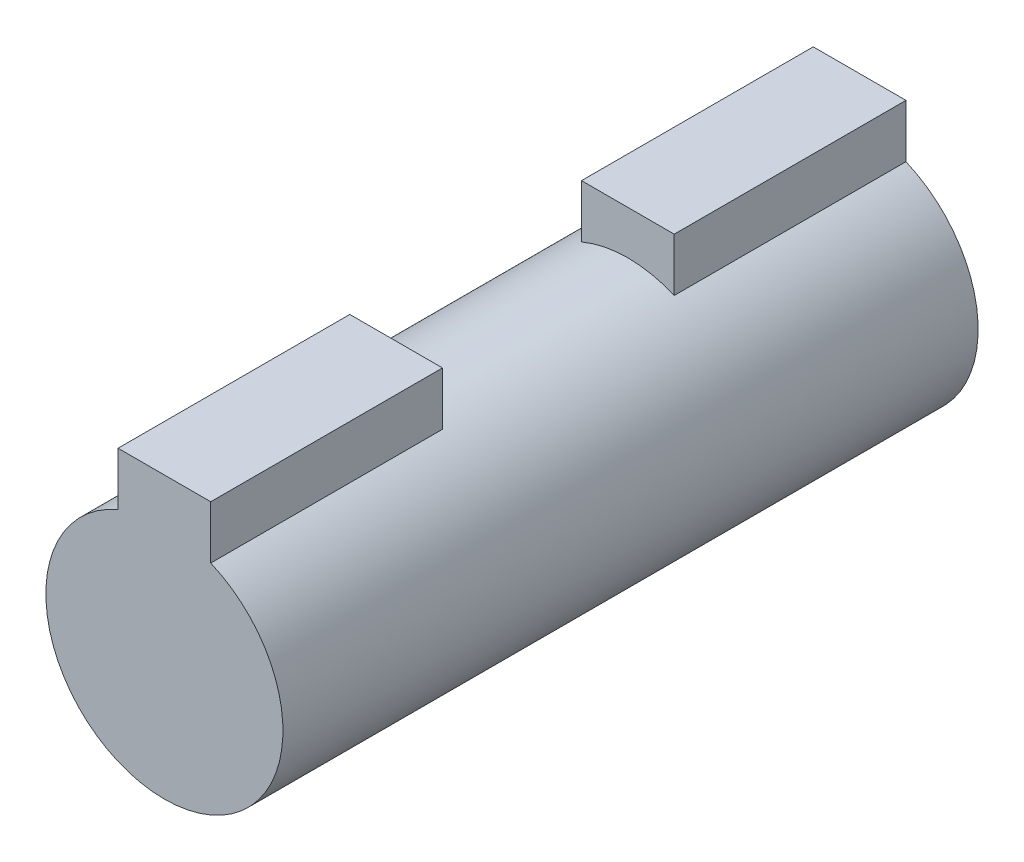
ISO-10303-21;
HEADER;
FILE_DESCRIPTION(('STEP AP214'),'2;1');
FILE_NAME('part.step','',(''),(''),'','','');
FILE_SCHEMA(('AUTOMOTIVE_DESIGN { 1 0 10303 214 1 1 1 1 }'));
ENDSEC;
DATA;
#1=APPLICATION_CONTEXT('core data for automotive mechanical design processes');
#2=APPLICATION_PROTOCOL_DEFINITION('international standard','automotive_design',2000,#1);
#3=PRODUCT_CONTEXT('',#1,'mechanical');
#4=PRODUCT('Part','Part','',(#3));
#5=PRODUCT_RELATED_PRODUCT_CATEGORY('part','',(#4));
#6=PRODUCT_DEFINITION_FORMATION('','',#4);
#7=PRODUCT_DEFINITION_CONTEXT('part definition',#1,'design');
#8=PRODUCT_DEFINITION('design','',#6,#7);
#9=PRODUCT_DEFINITION_SHAPE('','',#8);
#10=(LENGTH_UNIT() NAMED_UNIT(*) SI_UNIT(.MILLI.,.METRE.));
#11=(NAMED_UNIT(*) PLANE_ANGLE_UNIT() SI_UNIT($,.RADIAN.));
#12=(NAMED_UNIT(*) SI_UNIT($,.STERADIAN.) SOLID_ANGLE_UNIT());
#13=UNCERTAINTY_MEASURE_WITH_UNIT(LENGTH_MEASURE(1.E-05),#10,'distance_accuracy_value','');
#14=(GEOMETRIC_REPRESENTATION_CONTEXT(3) GLOBAL_UNCERTAINTY_ASSIGNED_CONTEXT((#13)) GLOBAL_UNIT_ASSIGNED_CONTEXT((#10,
#11,#12)) REPRESENTATION_CONTEXT('',''));
#15=CARTESIAN_POINT('',(0.,0.,0.));
#16=DIRECTION('',(0.,0.,1.));
#17=DIRECTION('',(1.,0.,0.));
#18=AXIS2_PLACEMENT_3D('',#15,#16,#17);
#19=CARTESIAN_POINT('',(2.,4.70778344871554,30.));
#20=DIRECTION('',(-1.,0.,0.));
#21=DIRECTION('',(0.,0.,1.));
#22=AXIS2_PLACEMENT_3D('',#19,#20,#21);
#23=PLANE('',#22);
#24=DIRECTION('',(0.,1.,0.));
#25=VECTOR('',#24,1.);
#26=CARTESIAN_POINT('',(2.,4.70778344871554,9.99999999999999));
#27=LINE('',#26,#25);
#28=CARTESIAN_POINT('',(2.,4.70778344871554,10.));
#29=VERTEX_POINT('',#28);
#30=CARTESIAN_POINT('',(2.,7.,9.99999999999999));
#31=VERTEX_POINT('',#30);
#32=EDGE_CURVE('E115',#29,#31,#27,.T.);
#33=ORIENTED_EDGE('',*,*,#32,.F.);
#34=DIRECTION('',(0.,0.,-1.));
#35=VECTOR('',#34,1.);
#36=CARTESIAN_POINT('',(2.,4.70778344871554,30.));
#37=LINE('',#36,#35);
#38=CARTESIAN_POINT('',(2.,4.70778344871554,0.));
#39=VERTEX_POINT('',#38);
#40=EDGE_CURVE('E125',#29,#39,#37,.T.);
#41=ORIENTED_EDGE('',*,*,#40,.T.);
#42=DIRECTION('',(0.,1.,0.));
#43=VECTOR('',#42,1.);
#44=CARTESIAN_POINT('',(2.,4.70778344871554,0.));
#45=LINE('',#44,#43);
#46=CARTESIAN_POINT('',(2.,7.,0.));
#47=VERTEX_POINT('',#46);
#48=EDGE_CURVE('E175',#39,#47,#45,.T.);
#49=ORIENTED_EDGE('',*,*,#48,.T.);
#50=DIRECTION('',(0.,0.,-1.));
#51=VECTOR('',#50,1.);
#52=CARTESIAN_POINT('',(2.,7.,30.));
#53=LINE('',#52,#51);
#54=EDGE_CURVE('E127',#31,#47,#53,.T.);
#55=ORIENTED_EDGE('',*,*,#54,.F.);
#56=EDGE_LOOP('',(#33,#41,#49,#55));
#57=FACE_BOUND('',#56,.T.);
#58=ADVANCED_FACE('F41',(#57),#23,.F.);
#59=CARTESIAN_POINT('',(-2.,7.,30.));
#60=DIRECTION('',(0.,-1.,0.));
#61=DIRECTION('',(0.,0.,-1.));
#62=AXIS2_PLACEMENT_3D('',#59,#60,#61);
#63=PLANE('',#62);
#64=DIRECTION('',(-1.,0.,0.));
#65=VECTOR('',#64,1.);
#66=CARTESIAN_POINT('',(-2.,7.,9.99999999999999));
#67=LINE('',#66,#65);
#68=CARTESIAN_POINT('',(-2.,7.,9.99999999999999));
#69=VERTEX_POINT('',#68);
#70=EDGE_CURVE('E130',#31,#69,#67,.T.);
#71=ORIENTED_EDGE('',*,*,#70,.F.);
#72=ORIENTED_EDGE('',*,*,#54,.T.);
#73=DIRECTION('',(-1.,0.,0.));
#74=VECTOR('',#73,1.);
#75=CARTESIAN_POINT('',(-2.,7.,0.));
#76=LINE('',#75,#74);
#77=CARTESIAN_POINT('',(-2.,7.,0.));
#78=VERTEX_POINT('',#77);
#79=EDGE_CURVE('E173',#47,#78,#76,.T.);
#80=ORIENTED_EDGE('',*,*,#79,.T.);
#81=DIRECTION('',(0.,0.,-1.));
#82=VECTOR('',#81,1.);
#83=CARTESIAN_POINT('',(-2.,7.,30.));
#84=LINE('',#83,#82);
#85=EDGE_CURVE('E159',#69,#78,#84,.T.);
#86=ORIENTED_EDGE('',*,*,#85,.F.);
#87=EDGE_LOOP('',(#71,#72,#80,#86));
#88=FACE_BOUND('',#87,.T.);
#89=ADVANCED_FACE('F170',(#88),#63,.F.);
#90=CARTESIAN_POINT('',(-2.,4.70778344871554,30.));
#91=DIRECTION('',(1.,0.,0.));
#92=DIRECTION('',(0.,0.,-1.));
#93=AXIS2_PLACEMENT_3D('',#90,#91,#92);
#94=PLANE('',#93);
#95=DIRECTION('',(0.,-1.,0.));
#96=VECTOR('',#95,1.);
#97=CARTESIAN_POINT('',(-2.,4.70778344871554,9.99999999999999));
#98=LINE('',#97,#96);
#99=CARTESIAN_POINT('',(-2.,4.70778344871554,9.99999999999999));
#100=VERTEX_POINT('',#99);
#101=EDGE_CURVE('E11',#69,#100,#98,.T.);
#102=ORIENTED_EDGE('',*,*,#101,.F.);
#103=ORIENTED_EDGE('',*,*,#85,.T.);
#104=DIRECTION('',(0.,-1.,0.));
#105=VECTOR('',#104,1.);
#106=CARTESIAN_POINT('',(-2.,4.70778344871554,0.));
#107=LINE('',#106,#105);
#108=CARTESIAN_POINT('',(-2.,4.70778344871554,0.));
#109=VERTEX_POINT('',#108);
#110=EDGE_CURVE('E164',#78,#109,#107,.T.);
#111=ORIENTED_EDGE('',*,*,#110,.T.);
#112=DIRECTION('',(0.,0.,-1.));
#113=VECTOR('',#112,1.);
#114=CARTESIAN_POINT('',(-2.,4.70778344871554,30.));
#115=LINE('',#114,#113);
#116=EDGE_CURVE('E84',#100,#109,#115,.T.);
#117=ORIENTED_EDGE('',*,*,#116,.F.);
#118=EDGE_LOOP('',(#102,#103,#111,#117));
#119=FACE_BOUND('',#118,.T.);
#120=ADVANCED_FACE('F217',(#119),#94,.F.);
#121=CARTESIAN_POINT('',(0.,0.,30.));
#122=DIRECTION('',(0.,0.,-1.));
#123=DIRECTION('',(-1.,0.,0.));
#124=AXIS2_PLACEMENT_3D('',#121,#122,#123);
#125=CYLINDRICAL_SURFACE('',#124,5.115);
#126=CARTESIAN_POINT('',(-2.,4.70778344871554,30.));
#127=VERTEX_POINT('',#126);
#128=CARTESIAN_POINT('',(-2.,4.70778344871554,20.));
#129=VERTEX_POINT('',#128);
#130=EDGE_CURVE('E148',#127,#129,#115,.T.);
#131=ORIENTED_EDGE('',*,*,#130,.T.);
#132=CARTESIAN_POINT('',(0.,0.,20.));
#133=DIRECTION('',(0.,0.,1.));
#134=DIRECTION('',(1.,0.,0.));
#135=AXIS2_PLACEMENT_3D('',#132,#133,#134);
#136=CIRCLE('',#135,5.115);
#137=CARTESIAN_POINT('',(2.,4.70778344871554,20.));
#138=VERTEX_POINT('',#137);
#139=EDGE_CURVE('E120',#138,#129,#136,.T.);
#140=ORIENTED_EDGE('',*,*,#139,.F.);
#141=CARTESIAN_POINT('',(2.,4.70778344871554,30.));
#142=VERTEX_POINT('',#141);
#143=EDGE_CURVE('E134',#142,#138,#37,.T.);
#144=ORIENTED_EDGE('',*,*,#143,.F.);
#145=CARTESIAN_POINT('',(0.,0.,30.));
#146=DIRECTION('',(0.,0.,1.));
#147=DIRECTION('',(1.,0.,0.));
#148=AXIS2_PLACEMENT_3D('',#145,#146,#147);
#149=CIRCLE('',#148,5.115);
#150=EDGE_CURVE('E157',#127,#142,#149,.T.);
#151=ORIENTED_EDGE('',*,*,#150,.F.);
#152=EDGE_LOOP('',(#131,#140,#144,#151));
#153=FACE_BOUND('',#152,.T.);
#154=CARTESIAN_POINT('',(0.,0.,10.));
#155=DIRECTION('',(0.,0.,1.));
#156=DIRECTION('',(1.,0.,0.));
#157=AXIS2_PLACEMENT_3D('',#154,#155,#156);
#158=CIRCLE('',#157,5.115);
#159=EDGE_CURVE('E57',#29,#100,#158,.T.);
#160=ORIENTED_EDGE('',*,*,#159,.T.);
#161=ORIENTED_EDGE('',*,*,#116,.T.);
#162=CARTESIAN_POINT('',(0.,0.,0.));
#163=DIRECTION('',(0.,0.,1.));
#164=DIRECTION('',(1.,0.,0.));
#165=AXIS2_PLACEMENT_3D('',#162,#163,#164);
#166=CIRCLE('',#165,5.115);
#167=EDGE_CURVE('E129',#109,#39,#166,.T.);
#168=ORIENTED_EDGE('',*,*,#167,.T.);
#169=ORIENTED_EDGE('',*,*,#40,.F.);
#170=EDGE_LOOP('',(#160,#161,#168,#169));
#171=FACE_BOUND('',#170,.T.);
#172=ADVANCED_FACE('F43',(#153,#171),#125,.T.);
#173=ORIENTED_EDGE('',*,*,#143,.T.);
#174=DIRECTION('',(0.,1.,0.));
#175=VECTOR('',#174,1.);
#176=CARTESIAN_POINT('',(2.,4.70778344871554,20.));
#177=LINE('',#176,#175);
#178=CARTESIAN_POINT('',(2.,7.,20.));
#179=VERTEX_POINT('',#178);
#180=EDGE_CURVE('E196',#138,#179,#177,.T.);
#181=ORIENTED_EDGE('',*,*,#180,.T.);
#182=CARTESIAN_POINT('',(2.,7.,30.));
#183=VERTEX_POINT('',#182);
#184=EDGE_CURVE('E135',#183,#179,#53,.T.);
#185=ORIENTED_EDGE('',*,*,#184,.F.);
#186=DIRECTION('',(0.,1.,0.));
#187=VECTOR('',#186,1.);
#188=CARTESIAN_POINT('',(2.,4.70778344871554,30.));
#189=LINE('',#188,#187);
#190=EDGE_CURVE('E92',#142,#183,#189,.T.);
#191=ORIENTED_EDGE('',*,*,#190,.F.);
#192=EDGE_LOOP('',(#173,#181,#185,#191));
#193=FACE_BOUND('',#192,.T.);
#194=ADVANCED_FACE('F204',(#193),#23,.F.);
#195=ORIENTED_EDGE('',*,*,#184,.T.);
#196=DIRECTION('',(-1.,0.,0.));
#197=VECTOR('',#196,1.);
#198=CARTESIAN_POINT('',(-2.,7.,20.));
#199=LINE('',#198,#197);
#200=CARTESIAN_POINT('',(-2.,7.,20.));
#201=VERTEX_POINT('',#200);
#202=EDGE_CURVE('E119',#179,#201,#199,.T.);
#203=ORIENTED_EDGE('',*,*,#202,.T.);
#204=CARTESIAN_POINT('',(-2.,7.,30.));
#205=VERTEX_POINT('',#204);
#206=EDGE_CURVE('E151',#205,#201,#84,.T.);
#207=ORIENTED_EDGE('',*,*,#206,.F.);
#208=DIRECTION('',(-1.,0.,0.));
#209=VECTOR('',#208,1.);
#210=CARTESIAN_POINT('',(-2.,7.,30.));
#211=LINE('',#210,#209);
#212=EDGE_CURVE('E187',#183,#205,#211,.T.);
#213=ORIENTED_EDGE('',*,*,#212,.F.);
#214=EDGE_LOOP('',(#195,#203,#207,#213));
#215=FACE_BOUND('',#214,.T.);
#216=ADVANCED_FACE('F207',(#215),#63,.F.);
#217=ORIENTED_EDGE('',*,*,#206,.T.);
#218=DIRECTION('',(0.,-1.,0.));
#219=VECTOR('',#218,1.);
#220=CARTESIAN_POINT('',(-2.,4.70778344871554,20.));
#221=LINE('',#220,#219);
#222=EDGE_CURVE('E50',#201,#129,#221,.T.);
#223=ORIENTED_EDGE('',*,*,#222,.T.);
#224=ORIENTED_EDGE('',*,*,#130,.F.);
#225=DIRECTION('',(0.,-1.,0.));
#226=VECTOR('',#225,1.);
#227=CARTESIAN_POINT('',(-2.,4.70778344871554,30.));
#228=LINE('',#227,#226);
#229=EDGE_CURVE('E65',#205,#127,#228,.T.);
#230=ORIENTED_EDGE('',*,*,#229,.F.);
#231=EDGE_LOOP('',(#217,#223,#224,#230));
#232=FACE_BOUND('',#231,.T.);
#233=ADVANCED_FACE('F147',(#232),#94,.F.);
#234=CARTESIAN_POINT('',(0.,0.,30.));
#235=DIRECTION('',(0.,0.,1.));
#236=DIRECTION('',(1.,0.,0.));
#237=AXIS2_PLACEMENT_3D('',#234,#235,#236);
#238=PLANE('',#237);
#239=ORIENTED_EDGE('',*,*,#150,.T.);
#240=ORIENTED_EDGE('',*,*,#190,.T.);
#241=ORIENTED_EDGE('',*,*,#212,.T.);
#242=ORIENTED_EDGE('',*,*,#229,.T.);
#243=EDGE_LOOP('',(#239,#240,#241,#242));
#244=FACE_BOUND('',#243,.T.);
#245=ADVANCED_FACE('F208',(#244),#238,.T.);
#246=CARTESIAN_POINT('',(0.,0.,0.));
#247=DIRECTION('',(0.,0.,1.));
#248=DIRECTION('',(1.,0.,0.));
#249=AXIS2_PLACEMENT_3D('',#246,#247,#248);
#250=PLANE('',#249);
#251=ORIENTED_EDGE('',*,*,#167,.F.);
#252=ORIENTED_EDGE('',*,*,#110,.F.);
#253=ORIENTED_EDGE('',*,*,#79,.F.);
#254=ORIENTED_EDGE('',*,*,#48,.F.);
#255=EDGE_LOOP('',(#251,#252,#253,#254));
#256=FACE_BOUND('',#255,.T.);
#257=ADVANCED_FACE('F179',(#256),#250,.F.);
#258=CARTESIAN_POINT('',(0.,0.,10.));
#259=DIRECTION('',(0.,0.,1.));
#260=DIRECTION('',(1.,0.,0.));
#261=AXIS2_PLACEMENT_3D('',#258,#259,#260);
#262=PLANE('',#261);
#263=ORIENTED_EDGE('',*,*,#32,.T.);
#264=ORIENTED_EDGE('',*,*,#70,.T.);
#265=ORIENTED_EDGE('',*,*,#101,.T.);
#266=ORIENTED_EDGE('',*,*,#159,.F.);
#267=EDGE_LOOP('',(#263,#264,#265,#266));
#268=FACE_BOUND('',#267,.T.);
#269=ADVANCED_FACE('F114',(#268),#262,.T.);
#270=CARTESIAN_POINT('',(0.,0.,20.));
#271=DIRECTION('',(0.,0.,1.));
#272=DIRECTION('',(1.,0.,0.));
#273=AXIS2_PLACEMENT_3D('',#270,#271,#272);
#274=PLANE('',#273);
#275=ORIENTED_EDGE('',*,*,#139,.T.);
#276=ORIENTED_EDGE('',*,*,#222,.F.);
#277=ORIENTED_EDGE('',*,*,#202,.F.);
#278=ORIENTED_EDGE('',*,*,#180,.F.);
#279=EDGE_LOOP('',(#275,#276,#277,#278));
#280=FACE_BOUND('',#279,.T.);
#281=ADVANCED_FACE('F203',(#280),#274,.F.);
#282=CLOSED_SHELL('',(#58,#89,#120,#172,#194,#216,#233,#245,#257,#269,#281));
#283=MANIFOLD_SOLID_BREP('B2',#282);
#284=ADVANCED_BREP_SHAPE_REPRESENTATION('',(#18,#283),#14);
#285=SHAPE_DEFINITION_REPRESENTATION(#9,#284);
ENDSEC;
END-ISO-10303-21;
